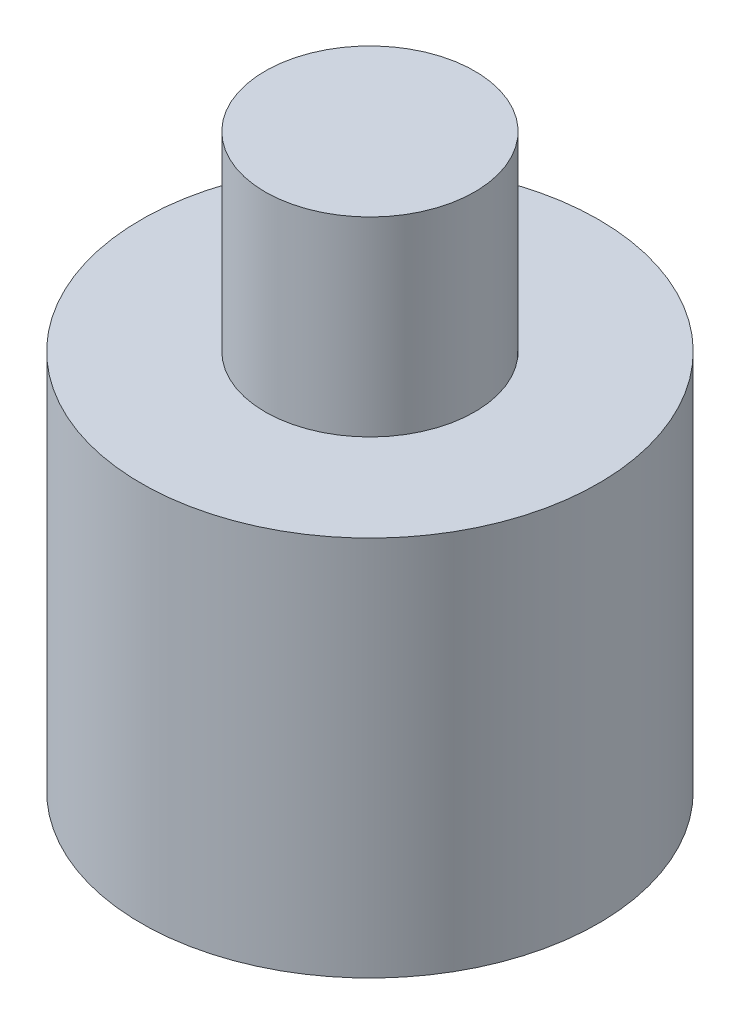
ISO-10303-21;
HEADER;
FILE_DESCRIPTION(('STEP AP214'),'2;1');
FILE_NAME('part.step','',(''),(''),'','','');
FILE_SCHEMA(('AUTOMOTIVE_DESIGN { 1 0 10303 214 1 1 1 1 }'));
ENDSEC;
DATA;
#1=APPLICATION_CONTEXT('core data for automotive mechanical design processes');
#2=APPLICATION_PROTOCOL_DEFINITION('international standard','automotive_design',2000,#1);
#3=PRODUCT_CONTEXT('',#1,'mechanical');
#4=PRODUCT('Part','Part','',(#3));
#5=PRODUCT_RELATED_PRODUCT_CATEGORY('part','',(#4));
#6=PRODUCT_DEFINITION_FORMATION('','',#4);
#7=PRODUCT_DEFINITION_CONTEXT('part definition',#1,'design');
#8=PRODUCT_DEFINITION('design','',#6,#7);
#9=PRODUCT_DEFINITION_SHAPE('','',#8);
#10=(LENGTH_UNIT() NAMED_UNIT(*) SI_UNIT(.MILLI.,.METRE.));
#11=(NAMED_UNIT(*) PLANE_ANGLE_UNIT() SI_UNIT($,.RADIAN.));
#12=(NAMED_UNIT(*) SI_UNIT($,.STERADIAN.) SOLID_ANGLE_UNIT());
#13=UNCERTAINTY_MEASURE_WITH_UNIT(LENGTH_MEASURE(1.E-05),#10,'distance_accuracy_value','');
#14=(GEOMETRIC_REPRESENTATION_CONTEXT(3) GLOBAL_UNCERTAINTY_ASSIGNED_CONTEXT((#13)) GLOBAL_UNIT_ASSIGNED_CONTEXT((#10,
#11,#12)) REPRESENTATION_CONTEXT('',''));
#15=CARTESIAN_POINT('',(0.,0.,0.));
#16=DIRECTION('',(0.,0.,1.));
#17=DIRECTION('',(1.,0.,0.));
#18=AXIS2_PLACEMENT_3D('',#15,#16,#17);
#19=CARTESIAN_POINT('',(0.,-5.,0.));
#20=DIRECTION('',(0.,1.,0.));
#21=DIRECTION('',(0.,0.,1.));
#22=AXIS2_PLACEMENT_3D('',#19,#20,#21);
#23=CYLINDRICAL_SURFACE('',#22,2.74999999999981);
#24=CARTESIAN_POINT('',(0.,-5.,0.));
#25=DIRECTION('',(0.,1.,0.));
#26=DIRECTION('',(0.,0.,1.));
#27=AXIS2_PLACEMENT_3D('',#24,#25,#26);
#28=CIRCLE('',#27,2.74999999999981);
#29=CARTESIAN_POINT('',(0.,-5.,2.74999999999981));
#30=VERTEX_POINT('',#29);
#31=EDGE_CURVE('E50',#30,#30,#28,.T.);
#32=ORIENTED_EDGE('',*,*,#31,.T.);
#33=EDGE_LOOP('',(#32));
#34=FACE_BOUND('',#33,.T.);
#35=CARTESIAN_POINT('',(0.,0.,0.));
#36=DIRECTION('',(0.,1.,0.));
#37=DIRECTION('',(0.,0.,1.));
#38=AXIS2_PLACEMENT_3D('',#35,#36,#37);
#39=CIRCLE('',#38,2.74999999999981);
#40=CARTESIAN_POINT('',(0.,0.,2.74999999999981));
#41=VERTEX_POINT('',#40);
#42=EDGE_CURVE('E10',#41,#41,#39,.T.);
#43=ORIENTED_EDGE('',*,*,#42,.F.);
#44=EDGE_LOOP('',(#43));
#45=FACE_BOUND('',#44,.T.);
#46=ADVANCED_FACE('F43',(#34,#45),#23,.T.);
#47=CARTESIAN_POINT('',(0.,0.,0.));
#48=DIRECTION('',(0.,1.,0.));
#49=DIRECTION('',(0.,0.,1.));
#50=AXIS2_PLACEMENT_3D('',#47,#48,#49);
#51=PLANE('',#50);
#52=ORIENTED_EDGE('',*,*,#42,.T.);
#53=EDGE_LOOP('',(#52));
#54=FACE_BOUND('',#53,.T.);
#55=ADVANCED_FACE('F81',(#54),#51,.T.);
#56=CARTESIAN_POINT('',(0.,-15.,0.));
#57=DIRECTION('',(0.,1.,0.));
#58=DIRECTION('',(0.,0.,1.));
#59=AXIS2_PLACEMENT_3D('',#56,#57,#58);
#60=CYLINDRICAL_SURFACE('',#59,6.00000000000023);
#61=CARTESIAN_POINT('',(0.,-15.,0.));
#62=DIRECTION('',(0.,-1.,0.));
#63=DIRECTION('',(0.,0.,-1.));
#64=AXIS2_PLACEMENT_3D('',#61,#62,#63);
#65=CIRCLE('',#64,6.00000000000023);
#66=CARTESIAN_POINT('',(0.,-15.,-6.00000000000023));
#67=VERTEX_POINT('',#66);
#68=EDGE_CURVE('E55',#67,#67,#65,.T.);
#69=ORIENTED_EDGE('',*,*,#68,.F.);
#70=EDGE_LOOP('',(#69));
#71=FACE_BOUND('',#70,.T.);
#72=CARTESIAN_POINT('',(0.,-5.,0.));
#73=DIRECTION('',(0.,-1.,0.));
#74=DIRECTION('',(0.,0.,-1.));
#75=AXIS2_PLACEMENT_3D('',#72,#73,#74);
#76=CIRCLE('',#75,6.00000000000023);
#77=CARTESIAN_POINT('',(0.,-5.,-6.00000000000023));
#78=VERTEX_POINT('',#77);
#79=EDGE_CURVE('E60',#78,#78,#76,.T.);
#80=ORIENTED_EDGE('',*,*,#79,.T.);
#81=EDGE_LOOP('',(#80));
#82=FACE_BOUND('',#81,.T.);
#83=ADVANCED_FACE('F67',(#71,#82),#60,.T.);
#84=CARTESIAN_POINT('',(0.,-15.,0.));
#85=DIRECTION('',(0.,-1.,0.));
#86=DIRECTION('',(0.,0.,-1.));
#87=AXIS2_PLACEMENT_3D('',#84,#85,#86);
#88=PLANE('',#87);
#89=ORIENTED_EDGE('',*,*,#68,.T.);
#90=EDGE_LOOP('',(#89));
#91=FACE_BOUND('',#90,.T.);
#92=ADVANCED_FACE('F71',(#91),#88,.T.);
#93=CARTESIAN_POINT('',(0.,-5.,0.));
#94=DIRECTION('',(0.,-1.,0.));
#95=DIRECTION('',(0.,0.,-1.));
#96=AXIS2_PLACEMENT_3D('',#93,#94,#95);
#97=PLANE('',#96);
#98=ORIENTED_EDGE('',*,*,#31,.F.);
#99=EDGE_LOOP('',(#98));
#100=FACE_BOUND('',#99,.T.);
#101=ORIENTED_EDGE('',*,*,#79,.F.);
#102=EDGE_LOOP('',(#101));
#103=FACE_BOUND('',#102,.T.);
#104=ADVANCED_FACE('F69',(#100,#103),#97,.F.);
#105=CLOSED_SHELL('',(#46,#55,#83,#92,#104));
#106=MANIFOLD_SOLID_BREP('B2',#105);
#107=ADVANCED_BREP_SHAPE_REPRESENTATION('',(#18,#106),#14);
#108=SHAPE_DEFINITION_REPRESENTATION(#9,#107);
ENDSEC;
END-ISO-10303-21;
